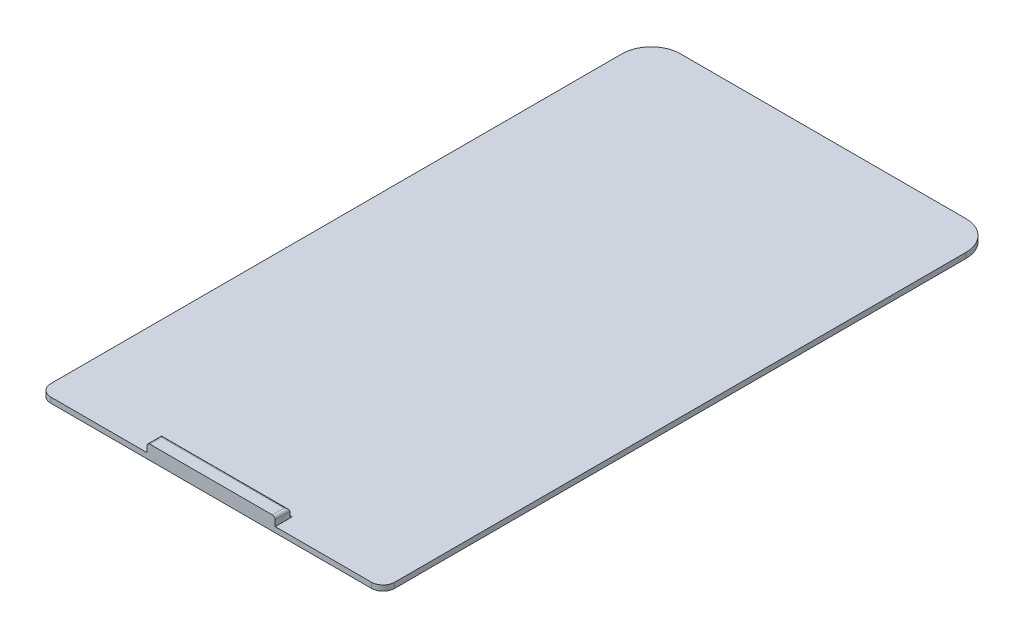
ISO-10303-21;
HEADER;
FILE_DESCRIPTION(('STEP AP214'),'2;1');
FILE_NAME('part.step','',(''),(''),'','','');
FILE_SCHEMA(('AUTOMOTIVE_DESIGN { 1 0 10303 214 1 1 1 1 }'));
ENDSEC;
DATA;
#1=APPLICATION_CONTEXT('core data for automotive mechanical design processes');
#2=APPLICATION_PROTOCOL_DEFINITION('international standard','automotive_design',2000,#1);
#3=PRODUCT_CONTEXT('',#1,'mechanical');
#4=PRODUCT('Part','Part','',(#3));
#5=PRODUCT_RELATED_PRODUCT_CATEGORY('part','',(#4));
#6=PRODUCT_DEFINITION_FORMATION('','',#4);
#7=PRODUCT_DEFINITION_CONTEXT('part definition',#1,'design');
#8=PRODUCT_DEFINITION('design','',#6,#7);
#9=PRODUCT_DEFINITION_SHAPE('','',#8);
#10=(LENGTH_UNIT() NAMED_UNIT(*) SI_UNIT(.MILLI.,.METRE.));
#11=(NAMED_UNIT(*) PLANE_ANGLE_UNIT() SI_UNIT($,.RADIAN.));
#12=(NAMED_UNIT(*) SI_UNIT($,.STERADIAN.) SOLID_ANGLE_UNIT());
#13=UNCERTAINTY_MEASURE_WITH_UNIT(LENGTH_MEASURE(1.E-05),#10,'distance_accuracy_value','');
#14=(GEOMETRIC_REPRESENTATION_CONTEXT(3) GLOBAL_UNCERTAINTY_ASSIGNED_CONTEXT((#13)) GLOBAL_UNIT_ASSIGNED_CONTEXT((#10,
#11,#12)) REPRESENTATION_CONTEXT('',''));
#15=CARTESIAN_POINT('',(0.,0.,0.));
#16=DIRECTION('',(0.,0.,1.));
#17=DIRECTION('',(1.,0.,0.));
#18=AXIS2_PLACEMENT_3D('',#15,#16,#17);
#19=CARTESIAN_POINT('',(-59.,0.925,-105.));
#20=DIRECTION('',(1.,0.,0.));
#21=DIRECTION('',(0.,0.,-1.));
#22=AXIS2_PLACEMENT_3D('',#19,#20,#21);
#23=PLANE('',#22);
#24=DIRECTION('',(0.,0.,1.));
#25=VECTOR('',#24,1.);
#26=CARTESIAN_POINT('',(-59.,0.925,-105.));
#27=LINE('',#26,#25);
#28=CARTESIAN_POINT('',(-59.,0.925,-100.));
#29=VERTEX_POINT('',#28);
#30=CARTESIAN_POINT('',(-59.,0.925,-2.));
#31=VERTEX_POINT('',#30);
#32=EDGE_CURVE('E189',#29,#31,#27,.T.);
#33=ORIENTED_EDGE('',*,*,#32,.F.);
#34=DIRECTION('',(0.,-1.,0.));
#35=VECTOR('',#34,1.);
#36=CARTESIAN_POINT('',(-59.,0.925,-100.));
#37=LINE('',#36,#35);
#38=CARTESIAN_POINT('',(-59.,0.,-100.));
#39=VERTEX_POINT('',#38);
#40=EDGE_CURVE('E246',#29,#39,#37,.T.);
#41=ORIENTED_EDGE('',*,*,#40,.T.);
#42=DIRECTION('',(0.,0.,1.));
#43=VECTOR('',#42,1.);
#44=CARTESIAN_POINT('',(-59.,0.,-105.));
#45=LINE('',#44,#43);
#46=CARTESIAN_POINT('',(-59.,0.,-2.));
#47=VERTEX_POINT('',#46);
#48=EDGE_CURVE('E166',#39,#47,#45,.T.);
#49=ORIENTED_EDGE('',*,*,#48,.T.);
#50=DIRECTION('',(0.,-1.,0.));
#51=VECTOR('',#50,1.);
#52=CARTESIAN_POINT('',(-59.,0.925,-2.));
#53=LINE('',#52,#51);
#54=EDGE_CURVE('E237',#47,#31,#53,.F.);
#55=ORIENTED_EDGE('',*,*,#54,.T.);
#56=EDGE_LOOP('',(#33,#41,#49,#55));
#57=FACE_BOUND('',#56,.T.);
#58=ADVANCED_FACE('F36',(#57),#23,.F.);
#59=CARTESIAN_POINT('',(-59.,0.925,0.));
#60=DIRECTION('',(0.,0.,-1.));
#61=DIRECTION('',(-1.,0.,0.));
#62=AXIS2_PLACEMENT_3D('',#59,#60,#61);
#63=PLANE('',#62);
#64=DIRECTION('',(1.,0.,0.));
#65=VECTOR('',#64,1.);
#66=CARTESIAN_POINT('',(-59.,0.925,0.));
#67=LINE('',#66,#65);
#68=CARTESIAN_POINT('',(-57.,0.925,0.));
#69=VERTEX_POINT('',#68);
#70=CARTESIAN_POINT('',(-40.5,0.925,0.));
#71=VERTEX_POINT('',#70);
#72=EDGE_CURVE('E144',#69,#71,#67,.T.);
#73=ORIENTED_EDGE('',*,*,#72,.F.);
#74=DIRECTION('',(0.,-1.,0.));
#75=VECTOR('',#74,1.);
#76=CARTESIAN_POINT('',(-57.,0.925,0.));
#77=LINE('',#76,#75);
#78=CARTESIAN_POINT('',(-57.,0.,0.));
#79=VERTEX_POINT('',#78);
#80=EDGE_CURVE('E230',#69,#79,#77,.T.);
#81=ORIENTED_EDGE('',*,*,#80,.T.);
#82=DIRECTION('',(1.,0.,0.));
#83=VECTOR('',#82,1.);
#84=CARTESIAN_POINT('',(-59.,0.,0.));
#85=LINE('',#84,#83);
#86=CARTESIAN_POINT('',(-2.,0.,0.));
#87=VERTEX_POINT('',#86);
#88=EDGE_CURVE('E197',#79,#87,#85,.T.);
#89=ORIENTED_EDGE('',*,*,#88,.T.);
#90=DIRECTION('',(0.,-1.,0.));
#91=VECTOR('',#90,1.);
#92=CARTESIAN_POINT('',(-2.,0.925,0.));
#93=LINE('',#92,#91);
#94=CARTESIAN_POINT('',(-2.,0.925,0.));
#95=VERTEX_POINT('',#94);
#96=EDGE_CURVE('E226',#87,#95,#93,.F.);
#97=ORIENTED_EDGE('',*,*,#96,.T.);
#98=CARTESIAN_POINT('',(-18.5,0.925,0.));
#99=VERTEX_POINT('',#98);
#100=EDGE_CURVE('E157',#99,#95,#67,.T.);
#101=ORIENTED_EDGE('',*,*,#100,.F.);
#102=DIRECTION('',(0.,-1.,0.));
#103=VECTOR('',#102,1.);
#104=CARTESIAN_POINT('',(-18.5,2.425,0.));
#105=LINE('',#104,#103);
#106=CARTESIAN_POINT('',(-18.5,1.925,0.));
#107=VERTEX_POINT('',#106);
#108=EDGE_CURVE('E167',#107,#99,#105,.T.);
#109=ORIENTED_EDGE('',*,*,#108,.F.);
#110=CARTESIAN_POINT('',(-19.,1.925,0.));
#111=DIRECTION('',(0.,0.,-1.));
#112=DIRECTION('',(-1.,0.,0.));
#113=AXIS2_PLACEMENT_3D('',#110,#111,#112);
#114=CIRCLE('',#113,0.5);
#115=CARTESIAN_POINT('',(-19.,2.425,0.));
#116=VERTEX_POINT('',#115);
#117=EDGE_CURVE('E209',#107,#116,#114,.F.);
#118=ORIENTED_EDGE('',*,*,#117,.T.);
#119=DIRECTION('',(1.,0.,0.));
#120=VECTOR('',#119,1.);
#121=CARTESIAN_POINT('',(-40.5,2.425,0.));
#122=LINE('',#121,#120);
#123=CARTESIAN_POINT('',(-40.,2.425,0.));
#124=VERTEX_POINT('',#123);
#125=EDGE_CURVE('E176',#124,#116,#122,.T.);
#126=ORIENTED_EDGE('',*,*,#125,.F.);
#127=CARTESIAN_POINT('',(-40.,1.925,0.));
#128=DIRECTION('',(0.,0.,-1.));
#129=DIRECTION('',(-1.,0.,0.));
#130=AXIS2_PLACEMENT_3D('',#127,#128,#129);
#131=CIRCLE('',#130,0.5);
#132=CARTESIAN_POINT('',(-40.5,1.925,0.));
#133=VERTEX_POINT('',#132);
#134=EDGE_CURVE('E163',#124,#133,#131,.F.);
#135=ORIENTED_EDGE('',*,*,#134,.T.);
#136=DIRECTION('',(0.,-1.,0.));
#137=VECTOR('',#136,1.);
#138=CARTESIAN_POINT('',(-40.5,2.425,0.));
#139=LINE('',#138,#137);
#140=EDGE_CURVE('E160',#133,#71,#139,.T.);
#141=ORIENTED_EDGE('',*,*,#140,.T.);
#142=EDGE_LOOP('',(#73,#81,#89,#97,#101,#109,#118,#126,#135,#141));
#143=FACE_BOUND('',#142,.T.);
#144=ADVANCED_FACE('F161',(#143),#63,.F.);
#145=CARTESIAN_POINT('',(0.,0.925,-105.));
#146=DIRECTION('',(-1.,0.,0.));
#147=DIRECTION('',(0.,0.,1.));
#148=AXIS2_PLACEMENT_3D('',#145,#146,#147);
#149=PLANE('',#148);
#150=DIRECTION('',(0.,0.,-1.));
#151=VECTOR('',#150,1.);
#152=CARTESIAN_POINT('',(0.,0.,-105.));
#153=LINE('',#152,#151);
#154=CARTESIAN_POINT('',(0.,0.,-2.));
#155=VERTEX_POINT('',#154);
#156=CARTESIAN_POINT('',(0.,0.,-100.));
#157=VERTEX_POINT('',#156);
#158=EDGE_CURVE('E200',#155,#157,#153,.T.);
#159=ORIENTED_EDGE('',*,*,#158,.T.);
#160=DIRECTION('',(0.,-1.,0.));
#161=VECTOR('',#160,1.);
#162=CARTESIAN_POINT('',(0.,0.925,-100.));
#163=LINE('',#162,#161);
#164=CARTESIAN_POINT('',(0.,0.925,-100.));
#165=VERTEX_POINT('',#164);
#166=EDGE_CURVE('E11',#157,#165,#163,.F.);
#167=ORIENTED_EDGE('',*,*,#166,.T.);
#168=DIRECTION('',(0.,0.,-1.));
#169=VECTOR('',#168,1.);
#170=CARTESIAN_POINT('',(0.,0.925,-105.));
#171=LINE('',#170,#169);
#172=CARTESIAN_POINT('',(0.,0.925,-2.));
#173=VERTEX_POINT('',#172);
#174=EDGE_CURVE('E156',#173,#165,#171,.T.);
#175=ORIENTED_EDGE('',*,*,#174,.F.);
#176=DIRECTION('',(0.,-1.,0.));
#177=VECTOR('',#176,1.);
#178=CARTESIAN_POINT('',(0.,0.925,-2.));
#179=LINE('',#178,#177);
#180=EDGE_CURVE('E243',#173,#155,#179,.T.);
#181=ORIENTED_EDGE('',*,*,#180,.T.);
#182=EDGE_LOOP('',(#159,#167,#175,#181));
#183=FACE_BOUND('',#182,.T.);
#184=ADVANCED_FACE('F274',(#183),#149,.F.);
#185=CARTESIAN_POINT('',(-59.,0.925,-105.));
#186=DIRECTION('',(0.,0.,1.));
#187=DIRECTION('',(1.,0.,0.));
#188=AXIS2_PLACEMENT_3D('',#185,#186,#187);
#189=PLANE('',#188);
#190=DIRECTION('',(-1.,0.,0.));
#191=VECTOR('',#190,1.);
#192=CARTESIAN_POINT('',(-59.,0.,-105.));
#193=LINE('',#192,#191);
#194=CARTESIAN_POINT('',(-5.,0.,-105.));
#195=VERTEX_POINT('',#194);
#196=CARTESIAN_POINT('',(-54.,0.,-105.));
#197=VERTEX_POINT('',#196);
#198=EDGE_CURVE('E190',#195,#197,#193,.T.);
#199=ORIENTED_EDGE('',*,*,#198,.T.);
#200=DIRECTION('',(0.,-1.,0.));
#201=VECTOR('',#200,1.);
#202=CARTESIAN_POINT('',(-54.,0.925,-105.));
#203=LINE('',#202,#201);
#204=CARTESIAN_POINT('',(-54.,0.925,-105.));
#205=VERTEX_POINT('',#204);
#206=EDGE_CURVE('E57',#197,#205,#203,.F.);
#207=ORIENTED_EDGE('',*,*,#206,.T.);
#208=DIRECTION('',(-1.,0.,0.));
#209=VECTOR('',#208,1.);
#210=CARTESIAN_POINT('',(-59.,0.925,-105.));
#211=LINE('',#210,#209);
#212=CARTESIAN_POINT('',(-5.,0.925,-105.));
#213=VERTEX_POINT('',#212);
#214=EDGE_CURVE('E193',#213,#205,#211,.T.);
#215=ORIENTED_EDGE('',*,*,#214,.F.);
#216=DIRECTION('',(0.,-1.,0.));
#217=VECTOR('',#216,1.);
#218=CARTESIAN_POINT('',(-5.,0.925,-105.));
#219=LINE('',#218,#217);
#220=EDGE_CURVE('E253',#213,#195,#219,.T.);
#221=ORIENTED_EDGE('',*,*,#220,.T.);
#222=EDGE_LOOP('',(#199,#207,#215,#221));
#223=FACE_BOUND('',#222,.T.);
#224=ADVANCED_FACE('F269',(#223),#189,.F.);
#225=CARTESIAN_POINT('',(0.,0.925,0.));
#226=DIRECTION('',(0.,1.,0.));
#227=DIRECTION('',(0.,0.,1.));
#228=AXIS2_PLACEMENT_3D('',#225,#226,#227);
#229=PLANE('',#228);
#230=ORIENTED_EDGE('',*,*,#214,.T.);
#231=CARTESIAN_POINT('',(-54.,0.925,-100.));
#232=DIRECTION('',(0.,1.,0.));
#233=DIRECTION('',(0.,0.,1.));
#234=AXIS2_PLACEMENT_3D('',#231,#232,#233);
#235=CIRCLE('',#234,5.);
#236=EDGE_CURVE('E44',#205,#29,#235,.T.);
#237=ORIENTED_EDGE('',*,*,#236,.T.);
#238=ORIENTED_EDGE('',*,*,#32,.T.);
#239=CARTESIAN_POINT('',(-57.,0.925,-2.));
#240=DIRECTION('',(0.,1.,0.));
#241=DIRECTION('',(0.,0.,1.));
#242=AXIS2_PLACEMENT_3D('',#239,#240,#241);
#243=CIRCLE('',#242,2.);
#244=EDGE_CURVE('E152',#31,#69,#243,.T.);
#245=ORIENTED_EDGE('',*,*,#244,.T.);
#246=ORIENTED_EDGE('',*,*,#72,.T.);
#247=DIRECTION('',(0.,0.,1.));
#248=VECTOR('',#247,1.);
#249=CARTESIAN_POINT('',(-40.5,0.925,-2.5));
#250=LINE('',#249,#248);
#251=CARTESIAN_POINT('',(-40.5,0.925,-3.));
#252=VERTEX_POINT('',#251);
#253=EDGE_CURVE('E149',#252,#71,#250,.T.);
#254=ORIENTED_EDGE('',*,*,#253,.F.);
#255=DIRECTION('',(-1.,0.,0.));
#256=VECTOR('',#255,1.);
#257=CARTESIAN_POINT('',(0.,0.925,-3.));
#258=LINE('',#257,#256);
#259=CARTESIAN_POINT('',(-18.5,0.925,-3.));
#260=VERTEX_POINT('',#259);
#261=EDGE_CURVE('E219',#252,#260,#258,.F.);
#262=ORIENTED_EDGE('',*,*,#261,.T.);
#263=DIRECTION('',(0.,0.,-1.));
#264=VECTOR('',#263,1.);
#265=CARTESIAN_POINT('',(-18.5,0.925,-2.5));
#266=LINE('',#265,#264);
#267=EDGE_CURVE('E173',#99,#260,#266,.T.);
#268=ORIENTED_EDGE('',*,*,#267,.F.);
#269=ORIENTED_EDGE('',*,*,#100,.T.);
#270=CARTESIAN_POINT('',(-2.,0.925,-2.));
#271=DIRECTION('',(0.,1.,0.));
#272=DIRECTION('',(0.,0.,1.));
#273=AXIS2_PLACEMENT_3D('',#270,#271,#272);
#274=CIRCLE('',#273,2.);
#275=EDGE_CURVE('E240',#95,#173,#274,.T.);
#276=ORIENTED_EDGE('',*,*,#275,.T.);
#277=ORIENTED_EDGE('',*,*,#174,.T.);
#278=CARTESIAN_POINT('',(-5.,0.925,-100.));
#279=DIRECTION('',(0.,1.,0.));
#280=DIRECTION('',(0.,0.,1.));
#281=AXIS2_PLACEMENT_3D('',#278,#279,#280);
#282=CIRCLE('',#281,5.);
#283=EDGE_CURVE('E257',#165,#213,#282,.T.);
#284=ORIENTED_EDGE('',*,*,#283,.T.);
#285=EDGE_LOOP('',(#230,#237,#238,#245,#246,#254,#262,#268,#269,#276,#277,#284));
#286=FACE_BOUND('',#285,.T.);
#287=ADVANCED_FACE('F146',(#286),#229,.T.);
#288=CARTESIAN_POINT('',(0.,0.,0.));
#289=DIRECTION('',(0.,1.,0.));
#290=DIRECTION('',(0.,0.,1.));
#291=AXIS2_PLACEMENT_3D('',#288,#289,#290);
#292=PLANE('',#291);
#293=ORIENTED_EDGE('',*,*,#48,.F.);
#294=CARTESIAN_POINT('',(-54.,0.,-100.));
#295=DIRECTION('',(0.,1.,0.));
#296=DIRECTION('',(0.,0.,1.));
#297=AXIS2_PLACEMENT_3D('',#294,#295,#296);
#298=CIRCLE('',#297,5.);
#299=EDGE_CURVE('E251',#39,#197,#298,.F.);
#300=ORIENTED_EDGE('',*,*,#299,.T.);
#301=ORIENTED_EDGE('',*,*,#198,.F.);
#302=CARTESIAN_POINT('',(-5.,0.,-100.));
#303=DIRECTION('',(0.,1.,0.));
#304=DIRECTION('',(0.,0.,1.));
#305=AXIS2_PLACEMENT_3D('',#302,#303,#304);
#306=CIRCLE('',#305,5.);
#307=EDGE_CURVE('E249',#195,#157,#306,.F.);
#308=ORIENTED_EDGE('',*,*,#307,.T.);
#309=ORIENTED_EDGE('',*,*,#158,.F.);
#310=CARTESIAN_POINT('',(-2.,0.,-2.));
#311=DIRECTION('',(0.,1.,0.));
#312=DIRECTION('',(0.,0.,1.));
#313=AXIS2_PLACEMENT_3D('',#310,#311,#312);
#314=CIRCLE('',#313,2.);
#315=EDGE_CURVE('E232',#155,#87,#314,.F.);
#316=ORIENTED_EDGE('',*,*,#315,.T.);
#317=ORIENTED_EDGE('',*,*,#88,.F.);
#318=CARTESIAN_POINT('',(-57.,0.,-2.));
#319=DIRECTION('',(0.,1.,0.));
#320=DIRECTION('',(0.,0.,1.));
#321=AXIS2_PLACEMENT_3D('',#318,#319,#320);
#322=CIRCLE('',#321,2.);
#323=EDGE_CURVE('E234',#79,#47,#322,.F.);
#324=ORIENTED_EDGE('',*,*,#323,.T.);
#325=EDGE_LOOP('',(#293,#300,#301,#308,#309,#316,#317,#324));
#326=FACE_BOUND('',#325,.T.);
#327=ADVANCED_FACE('F268',(#326),#292,.F.);
#328=CARTESIAN_POINT('',(-40.5,2.425,-2.5));
#329=DIRECTION('',(1.,0.,0.));
#330=DIRECTION('',(0.,0.,-1.));
#331=AXIS2_PLACEMENT_3D('',#328,#329,#330);
#332=PLANE('',#331);
#333=ORIENTED_EDGE('',*,*,#140,.F.);
#334=DIRECTION('',(0.,0.,1.));
#335=VECTOR('',#334,1.);
#336=CARTESIAN_POINT('',(-40.5,1.925,-2.5));
#337=LINE('',#336,#335);
#338=CARTESIAN_POINT('',(-40.5,1.925,-2.5));
#339=VERTEX_POINT('',#338);
#340=EDGE_CURVE('E212',#133,#339,#337,.F.);
#341=ORIENTED_EDGE('',*,*,#340,.T.);
#342=DIRECTION('',(0.,-1.,0.));
#343=VECTOR('',#342,1.);
#344=CARTESIAN_POINT('',(-40.5,2.425,-2.5));
#345=LINE('',#344,#343);
#346=CARTESIAN_POINT('',(-40.5,1.425,-2.5));
#347=VERTEX_POINT('',#346);
#348=EDGE_CURVE('E183',#339,#347,#345,.T.);
#349=ORIENTED_EDGE('',*,*,#348,.T.);
#350=CARTESIAN_POINT('',(-40.5,1.425,-3.));
#351=DIRECTION('',(1.,0.,0.));
#352=DIRECTION('',(0.,0.,-1.));
#353=AXIS2_PLACEMENT_3D('',#350,#351,#352);
#354=CIRCLE('',#353,0.5);
#355=EDGE_CURVE('E171',#347,#252,#354,.T.);
#356=ORIENTED_EDGE('',*,*,#355,.T.);
#357=ORIENTED_EDGE('',*,*,#253,.T.);
#358=EDGE_LOOP('',(#333,#341,#349,#356,#357));
#359=FACE_BOUND('',#358,.T.);
#360=ADVANCED_FACE('F169',(#359),#332,.F.);
#361=CARTESIAN_POINT('',(-18.5,2.425,-2.5));
#362=DIRECTION('',(-1.,0.,0.));
#363=DIRECTION('',(0.,0.,1.));
#364=AXIS2_PLACEMENT_3D('',#361,#362,#363);
#365=PLANE('',#364);
#366=DIRECTION('',(0.,-1.,0.));
#367=VECTOR('',#366,1.);
#368=CARTESIAN_POINT('',(-18.5,2.425,-2.5));
#369=LINE('',#368,#367);
#370=CARTESIAN_POINT('',(-18.5,1.925,-2.5));
#371=VERTEX_POINT('',#370);
#372=CARTESIAN_POINT('',(-18.5,1.425,-2.5));
#373=VERTEX_POINT('',#372);
#374=EDGE_CURVE('E185',#371,#373,#369,.T.);
#375=ORIENTED_EDGE('',*,*,#374,.F.);
#376=DIRECTION('',(0.,0.,-1.));
#377=VECTOR('',#376,1.);
#378=CARTESIAN_POINT('',(-18.5,1.925,0.));
#379=LINE('',#378,#377);
#380=EDGE_CURVE('E221',#371,#107,#379,.F.);
#381=ORIENTED_EDGE('',*,*,#380,.T.);
#382=ORIENTED_EDGE('',*,*,#108,.T.);
#383=ORIENTED_EDGE('',*,*,#267,.T.);
#384=CARTESIAN_POINT('',(-18.5,1.425,-3.));
#385=DIRECTION('',(-1.,0.,0.));
#386=DIRECTION('',(0.,0.,1.));
#387=AXIS2_PLACEMENT_3D('',#384,#385,#386);
#388=CIRCLE('',#387,0.5);
#389=EDGE_CURVE('E224',#260,#373,#388,.T.);
#390=ORIENTED_EDGE('',*,*,#389,.T.);
#391=EDGE_LOOP('',(#375,#381,#382,#383,#390));
#392=FACE_BOUND('',#391,.T.);
#393=ADVANCED_FACE('F338',(#392),#365,.F.);
#394=CARTESIAN_POINT('',(-40.5,2.425,-2.5));
#395=DIRECTION('',(0.,0.,1.));
#396=DIRECTION('',(1.,0.,0.));
#397=AXIS2_PLACEMENT_3D('',#394,#395,#396);
#398=PLANE('',#397);
#399=ORIENTED_EDGE('',*,*,#374,.T.);
#400=DIRECTION('',(-1.,0.,0.));
#401=VECTOR('',#400,1.);
#402=CARTESIAN_POINT('',(-40.5,1.425,-2.5));
#403=LINE('',#402,#401);
#404=EDGE_CURVE('E216',#373,#347,#403,.T.);
#405=ORIENTED_EDGE('',*,*,#404,.T.);
#406=ORIENTED_EDGE('',*,*,#348,.F.);
#407=DIRECTION('',(-1.,0.,0.));
#408=VECTOR('',#407,1.);
#409=CARTESIAN_POINT('',(-18.5,1.925,-2.5));
#410=LINE('',#409,#408);
#411=EDGE_CURVE('E214',#339,#371,#410,.F.);
#412=ORIENTED_EDGE('',*,*,#411,.T.);
#413=EDGE_LOOP('',(#399,#405,#406,#412));
#414=FACE_BOUND('',#413,.T.);
#415=ADVANCED_FACE('F318',(#414),#398,.F.);
#416=CARTESIAN_POINT('',(0.,2.425,0.));
#417=DIRECTION('',(0.,1.,0.));
#418=DIRECTION('',(0.,0.,1.));
#419=AXIS2_PLACEMENT_3D('',#416,#417,#418);
#420=PLANE('',#419);
#421=DIRECTION('',(-1.,0.,0.));
#422=VECTOR('',#421,1.);
#423=CARTESIAN_POINT('',(-40.5,2.425,-2.));
#424=LINE('',#423,#422);
#425=CARTESIAN_POINT('',(-19.,2.425,-2.));
#426=VERTEX_POINT('',#425);
#427=CARTESIAN_POINT('',(-40.,2.425,-2.));
#428=VERTEX_POINT('',#427);
#429=EDGE_CURVE('E204',#426,#428,#424,.T.);
#430=ORIENTED_EDGE('',*,*,#429,.T.);
#431=DIRECTION('',(0.,0.,1.));
#432=VECTOR('',#431,1.);
#433=CARTESIAN_POINT('',(-40.,2.425,0.));
#434=LINE('',#433,#432);
#435=EDGE_CURVE('E206',#428,#124,#434,.T.);
#436=ORIENTED_EDGE('',*,*,#435,.T.);
#437=ORIENTED_EDGE('',*,*,#125,.T.);
#438=DIRECTION('',(0.,0.,-1.));
#439=VECTOR('',#438,1.);
#440=CARTESIAN_POINT('',(-19.,2.425,-2.5));
#441=LINE('',#440,#439);
#442=EDGE_CURVE('E195',#116,#426,#441,.T.);
#443=ORIENTED_EDGE('',*,*,#442,.T.);
#444=EDGE_LOOP('',(#430,#436,#437,#443));
#445=FACE_BOUND('',#444,.T.);
#446=ADVANCED_FACE('F313',(#445),#420,.T.);
#447=CARTESIAN_POINT('',(-19.,1.925,0.));
#448=DIRECTION('',(0.,0.,1.));
#449=DIRECTION('',(1.,0.,0.));
#450=AXIS2_PLACEMENT_3D('',#447,#448,#449);
#451=CYLINDRICAL_SURFACE('',#450,0.5);
#452=ORIENTED_EDGE('',*,*,#117,.F.);
#453=ORIENTED_EDGE('',*,*,#380,.F.);
#454=CARTESIAN_POINT('',(-19.,1.925,-2.));
#455=DIRECTION('',(0.707106781186547,0.,0.707106781186547));
#456=DIRECTION('',(-0.707106781186547,0.,0.707106781186547));
#457=AXIS2_PLACEMENT_3D('',#454,#455,#456);
#458=ELLIPSE('',#457,0.707106781186547,0.5);
#459=EDGE_CURVE('E174',#426,#371,#458,.F.);
#460=ORIENTED_EDGE('',*,*,#459,.F.);
#461=ORIENTED_EDGE('',*,*,#442,.F.);
#462=EDGE_LOOP('',(#452,#453,#460,#461));
#463=FACE_BOUND('',#462,.T.);
#464=ADVANCED_FACE('F310',(#463),#451,.T.);
#465=CARTESIAN_POINT('',(0.,1.925,-2.));
#466=DIRECTION('',(1.,0.,0.));
#467=DIRECTION('',(0.,0.,-1.));
#468=AXIS2_PLACEMENT_3D('',#465,#466,#467);
#469=CYLINDRICAL_SURFACE('',#468,0.5);
#470=ORIENTED_EDGE('',*,*,#459,.T.);
#471=ORIENTED_EDGE('',*,*,#411,.F.);
#472=CARTESIAN_POINT('',(-40.,1.925,-2.));
#473=DIRECTION('',(0.707106781186547,0.,-0.707106781186547));
#474=DIRECTION('',(0.707106781186547,0.,0.707106781186547));
#475=AXIS2_PLACEMENT_3D('',#472,#473,#474);
#476=ELLIPSE('',#475,0.707106781186547,0.5);
#477=EDGE_CURVE('E179',#428,#339,#476,.F.);
#478=ORIENTED_EDGE('',*,*,#477,.F.);
#479=ORIENTED_EDGE('',*,*,#429,.F.);
#480=EDGE_LOOP('',(#470,#471,#478,#479));
#481=FACE_BOUND('',#480,.T.);
#482=ADVANCED_FACE('F306',(#481),#469,.T.);
#483=CARTESIAN_POINT('',(-40.,1.925,0.));
#484=DIRECTION('',(0.,0.,-1.));
#485=DIRECTION('',(-1.,0.,0.));
#486=AXIS2_PLACEMENT_3D('',#483,#484,#485);
#487=CYLINDRICAL_SURFACE('',#486,0.5);
#488=ORIENTED_EDGE('',*,*,#477,.T.);
#489=ORIENTED_EDGE('',*,*,#340,.F.);
#490=ORIENTED_EDGE('',*,*,#134,.F.);
#491=ORIENTED_EDGE('',*,*,#435,.F.);
#492=EDGE_LOOP('',(#488,#489,#490,#491));
#493=FACE_BOUND('',#492,.T.);
#494=ADVANCED_FACE('F293',(#493),#487,.T.);
#495=CARTESIAN_POINT('',(-40.5,1.425,-3.));
#496=DIRECTION('',(-1.,0.,0.));
#497=DIRECTION('',(0.,0.,1.));
#498=AXIS2_PLACEMENT_3D('',#495,#496,#497);
#499=CYLINDRICAL_SURFACE('',#498,0.5);
#500=ORIENTED_EDGE('',*,*,#389,.F.);
#501=ORIENTED_EDGE('',*,*,#261,.F.);
#502=ORIENTED_EDGE('',*,*,#355,.F.);
#503=ORIENTED_EDGE('',*,*,#404,.F.);
#504=EDGE_LOOP('',(#500,#501,#502,#503));
#505=FACE_BOUND('',#504,.T.);
#506=ADVANCED_FACE('F286',(#505),#499,.F.);
#507=CARTESIAN_POINT('',(-57.,0.925,-2.));
#508=DIRECTION('',(0.,-1.,0.));
#509=DIRECTION('',(0.,0.,-1.));
#510=AXIS2_PLACEMENT_3D('',#507,#508,#509);
#511=CYLINDRICAL_SURFACE('',#510,2.);
#512=ORIENTED_EDGE('',*,*,#244,.F.);
#513=ORIENTED_EDGE('',*,*,#54,.F.);
#514=ORIENTED_EDGE('',*,*,#323,.F.);
#515=ORIENTED_EDGE('',*,*,#80,.F.);
#516=EDGE_LOOP('',(#512,#513,#514,#515));
#517=FACE_BOUND('',#516,.T.);
#518=ADVANCED_FACE('F284',(#517),#511,.T.);
#519=CARTESIAN_POINT('',(-2.,0.925,-2.));
#520=DIRECTION('',(0.,-1.,0.));
#521=DIRECTION('',(0.,0.,-1.));
#522=AXIS2_PLACEMENT_3D('',#519,#520,#521);
#523=CYLINDRICAL_SURFACE('',#522,2.);
#524=ORIENTED_EDGE('',*,*,#275,.F.);
#525=ORIENTED_EDGE('',*,*,#96,.F.);
#526=ORIENTED_EDGE('',*,*,#315,.F.);
#527=ORIENTED_EDGE('',*,*,#180,.F.);
#528=EDGE_LOOP('',(#524,#525,#526,#527));
#529=FACE_BOUND('',#528,.T.);
#530=ADVANCED_FACE('F278',(#529),#523,.T.);
#531=CARTESIAN_POINT('',(-54.,0.925,-100.));
#532=DIRECTION('',(0.,-1.,0.));
#533=DIRECTION('',(0.,0.,-1.));
#534=AXIS2_PLACEMENT_3D('',#531,#532,#533);
#535=CYLINDRICAL_SURFACE('',#534,5.);
#536=ORIENTED_EDGE('',*,*,#236,.F.);
#537=ORIENTED_EDGE('',*,*,#206,.F.);
#538=ORIENTED_EDGE('',*,*,#299,.F.);
#539=ORIENTED_EDGE('',*,*,#40,.F.);
#540=EDGE_LOOP('',(#536,#537,#538,#539));
#541=FACE_BOUND('',#540,.T.);
#542=ADVANCED_FACE('F265',(#541),#535,.T.);
#543=CARTESIAN_POINT('',(-5.,0.925,-100.));
#544=DIRECTION('',(0.,-1.,0.));
#545=DIRECTION('',(0.,0.,-1.));
#546=AXIS2_PLACEMENT_3D('',#543,#544,#545);
#547=CYLINDRICAL_SURFACE('',#546,5.);
#548=ORIENTED_EDGE('',*,*,#283,.F.);
#549=ORIENTED_EDGE('',*,*,#166,.F.);
#550=ORIENTED_EDGE('',*,*,#307,.F.);
#551=ORIENTED_EDGE('',*,*,#220,.F.);
#552=EDGE_LOOP('',(#548,#549,#550,#551));
#553=FACE_BOUND('',#552,.T.);
#554=ADVANCED_FACE('F38',(#553),#547,.T.);
#555=CLOSED_SHELL('',(#58,#144,#184,#224,#287,#327,#360,#393,#415,#446,#464,#482,#494,#506,#518,
#530,#542,#554));
#556=MANIFOLD_SOLID_BREP('B2',#555);
#557=ADVANCED_BREP_SHAPE_REPRESENTATION('',(#18,#556),#14);
#558=SHAPE_DEFINITION_REPRESENTATION(#9,#557);
ENDSEC;
END-ISO-10303-21;
